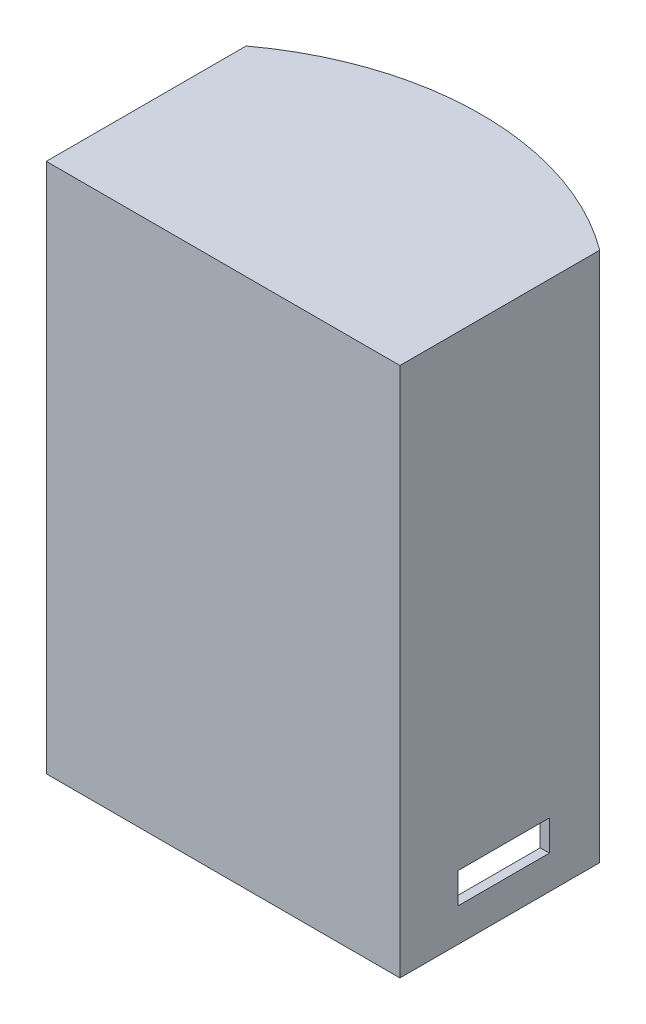
ISO-10303-21;
HEADER;
FILE_DESCRIPTION(('STEP AP214'),'2;1');
FILE_NAME('part.step','',(''),(''),'','','');
FILE_SCHEMA(('AUTOMOTIVE_DESIGN { 1 0 10303 214 1 1 1 1 }'));
ENDSEC;
DATA;
#1=APPLICATION_CONTEXT('core data for automotive mechanical design processes');
#2=APPLICATION_PROTOCOL_DEFINITION('international standard','automotive_design',2000,#1);
#3=PRODUCT_CONTEXT('',#1,'mechanical');
#4=PRODUCT('Part','Part','',(#3));
#5=PRODUCT_RELATED_PRODUCT_CATEGORY('part','',(#4));
#6=PRODUCT_DEFINITION_FORMATION('','',#4);
#7=PRODUCT_DEFINITION_CONTEXT('part definition',#1,'design');
#8=PRODUCT_DEFINITION('design','',#6,#7);
#9=PRODUCT_DEFINITION_SHAPE('','',#8);
#10=(LENGTH_UNIT() NAMED_UNIT(*) SI_UNIT(.MILLI.,.METRE.));
#11=(NAMED_UNIT(*) PLANE_ANGLE_UNIT() SI_UNIT($,.RADIAN.));
#12=(NAMED_UNIT(*) SI_UNIT($,.STERADIAN.) SOLID_ANGLE_UNIT());
#13=UNCERTAINTY_MEASURE_WITH_UNIT(LENGTH_MEASURE(1.E-05),#10,'distance_accuracy_value','');
#14=(GEOMETRIC_REPRESENTATION_CONTEXT(3) GLOBAL_UNCERTAINTY_ASSIGNED_CONTEXT((#13)) GLOBAL_UNIT_ASSIGNED_CONTEXT((#10,
#11,#12)) REPRESENTATION_CONTEXT('',''));
#15=CARTESIAN_POINT('',(0.,0.,0.));
#16=DIRECTION('',(0.,0.,1.));
#17=DIRECTION('',(1.,0.,0.));
#18=AXIS2_PLACEMENT_3D('',#15,#16,#17);
#19=CARTESIAN_POINT('',(16.,85.,15.));
#20=DIRECTION('',(1.,0.,0.));
#21=DIRECTION('',(0.,0.,-1.));
#22=AXIS2_PLACEMENT_3D('',#19,#20,#21);
#23=PLANE('',#22);
#24=DIRECTION('',(0.,1.,0.));
#25=VECTOR('',#24,1.);
#26=CARTESIAN_POINT('',(16.,85.,15.));
#27=LINE('',#26,#25);
#28=CARTESIAN_POINT('',(16.,11.,15.));
#29=VERTEX_POINT('',#28);
#30=CARTESIAN_POINT('',(16.,16.,15.));
#31=VERTEX_POINT('',#30);
#32=EDGE_CURVE('E264',#29,#31,#27,.T.);
#33=ORIENTED_EDGE('',*,*,#32,.T.);
#34=DIRECTION('',(0.,0.,1.));
#35=VECTOR('',#34,1.);
#36=CARTESIAN_POINT('',(16.,16.,12.));
#37=LINE('',#36,#35);
#38=CARTESIAN_POINT('',(16.,16.,12.));
#39=VERTEX_POINT('',#38);
#40=EDGE_CURVE('E300',#39,#31,#37,.T.);
#41=ORIENTED_EDGE('',*,*,#40,.F.);
#42=DIRECTION('',(0.,1.,0.));
#43=VECTOR('',#42,1.);
#44=CARTESIAN_POINT('',(16.,14.,12.));
#45=LINE('',#44,#43);
#46=CARTESIAN_POINT('',(16.,14.,12.));
#47=VERTEX_POINT('',#46);
#48=EDGE_CURVE('E292',#47,#39,#45,.T.);
#49=ORIENTED_EDGE('',*,*,#48,.F.);
#50=DIRECTION('',(0.,0.707106781186544,-0.707106781186551));
#51=VECTOR('',#50,1.);
#52=CARTESIAN_POINT('',(16.,47.9999999999997,-22.));
#53=LINE('',#52,#51);
#54=EDGE_CURVE('E11',#47,#29,#53,.F.);
#55=ORIENTED_EDGE('',*,*,#54,.T.);
#56=EDGE_LOOP('',(#33,#41,#49,#55));
#57=FACE_BOUND('',#56,.T.);
#58=ADVANCED_FACE('F35',(#57),#23,.F.);
#59=CARTESIAN_POINT('',(-16.,85.,15.));
#60=DIRECTION('',(-1.,0.,0.));
#61=DIRECTION('',(0.,0.,1.));
#62=AXIS2_PLACEMENT_3D('',#59,#60,#61);
#63=PLANE('',#62);
#64=DIRECTION('',(0.,-1.,0.));
#65=VECTOR('',#64,1.);
#66=CARTESIAN_POINT('',(-16.,85.,15.));
#67=LINE('',#66,#65);
#68=CARTESIAN_POINT('',(-16.,16.,15.));
#69=VERTEX_POINT('',#68);
#70=CARTESIAN_POINT('',(-16.,11.,15.));
#71=VERTEX_POINT('',#70);
#72=EDGE_CURVE('E262',#69,#71,#67,.T.);
#73=ORIENTED_EDGE('',*,*,#72,.T.);
#74=DIRECTION('',(0.,-0.707106781186544,0.707106781186551));
#75=VECTOR('',#74,1.);
#76=CARTESIAN_POINT('',(-16.,47.9999999999997,-22.));
#77=LINE('',#76,#75);
#78=CARTESIAN_POINT('',(-16.,14.,12.));
#79=VERTEX_POINT('',#78);
#80=EDGE_CURVE('E43',#71,#79,#77,.F.);
#81=ORIENTED_EDGE('',*,*,#80,.T.);
#82=DIRECTION('',(0.,-1.,0.));
#83=VECTOR('',#82,1.);
#84=CARTESIAN_POINT('',(-16.,14.,12.));
#85=LINE('',#84,#83);
#86=CARTESIAN_POINT('',(-16.,16.,12.));
#87=VERTEX_POINT('',#86);
#88=EDGE_CURVE('E272',#87,#79,#85,.T.);
#89=ORIENTED_EDGE('',*,*,#88,.F.);
#90=DIRECTION('',(0.,0.,1.));
#91=VECTOR('',#90,1.);
#92=CARTESIAN_POINT('',(-16.,16.,12.));
#93=LINE('',#92,#91);
#94=EDGE_CURVE('E278',#87,#69,#93,.T.);
#95=ORIENTED_EDGE('',*,*,#94,.T.);
#96=EDGE_LOOP('',(#73,#81,#89,#95));
#97=FACE_BOUND('',#96,.T.);
#98=ADVANCED_FACE('F384',(#97),#63,.F.);
#99=CARTESIAN_POINT('',(0.,85.,23.3475438007224));
#100=DIRECTION('',(0.,1.,0.));
#101=DIRECTION('',(0.,0.,1.));
#102=AXIS2_PLACEMENT_3D('',#99,#100,#101);
#103=PLANE('',#102);
#104=DIRECTION('',(-1.,0.,0.));
#105=VECTOR('',#104,1.);
#106=CARTESIAN_POINT('',(16.,85.,15.));
#107=LINE('',#106,#105);
#108=CARTESIAN_POINT('',(27.5,85.,15.));
#109=VERTEX_POINT('',#108);
#110=CARTESIAN_POINT('',(-27.5,85.,15.));
#111=VERTEX_POINT('',#110);
#112=EDGE_CURVE('E323',#109,#111,#107,.T.);
#113=ORIENTED_EDGE('',*,*,#112,.T.);
#114=DIRECTION('',(0.,0.,-1.));
#115=VECTOR('',#114,1.);
#116=CARTESIAN_POINT('',(-27.5,85.,15.));
#117=LINE('',#116,#115);
#118=CARTESIAN_POINT('',(-27.5,85.,-15.));
#119=VERTEX_POINT('',#118);
#120=EDGE_CURVE('E325',#111,#119,#117,.T.);
#121=ORIENTED_EDGE('',*,*,#120,.T.);
#122=CARTESIAN_POINT('',(0.,85.,23.3475438007224));
#123=DIRECTION('',(0.,-1.,0.));
#124=DIRECTION('',(0.,0.,-1.));
#125=AXIS2_PLACEMENT_3D('',#122,#123,#124);
#126=CIRCLE('',#125,47.1888134577288);
#127=CARTESIAN_POINT('',(27.5,85.,-15.));
#128=VERTEX_POINT('',#127);
#129=EDGE_CURVE('E316',#119,#128,#126,.T.);
#130=ORIENTED_EDGE('',*,*,#129,.T.);
#131=DIRECTION('',(0.,0.,1.));
#132=VECTOR('',#131,1.);
#133=CARTESIAN_POINT('',(27.5,85.,15.));
#134=LINE('',#133,#132);
#135=EDGE_CURVE('E319',#128,#109,#134,.T.);
#136=ORIENTED_EDGE('',*,*,#135,.T.);
#137=EDGE_LOOP('',(#113,#121,#130,#136));
#138=FACE_BOUND('',#137,.T.);
#139=ADVANCED_FACE('F413',(#138),#103,.F.);
#140=CARTESIAN_POINT('',(-27.5,85.,15.));
#141=DIRECTION('',(-1.,0.,0.));
#142=DIRECTION('',(0.,0.,1.));
#143=AXIS2_PLACEMENT_3D('',#140,#141,#142);
#144=PLANE('',#143);
#145=DIRECTION('',(0.,0.,-1.));
#146=VECTOR('',#145,1.);
#147=CARTESIAN_POINT('',(-27.5,10.4855256282735,15.));
#148=LINE('',#147,#146);
#149=CARTESIAN_POINT('',(-27.5,10.4855256282735,7.5));
#150=VERTEX_POINT('',#149);
#151=CARTESIAN_POINT('',(-27.5,10.4855256282735,-7.5));
#152=VERTEX_POINT('',#151);
#153=EDGE_CURVE('E244',#150,#152,#148,.T.);
#154=ORIENTED_EDGE('',*,*,#153,.T.);
#155=DIRECTION('',(0.,-1.,0.));
#156=VECTOR('',#155,1.);
#157=CARTESIAN_POINT('',(-27.5,85.,-7.49999999999995));
#158=LINE('',#157,#156);
#159=CARTESIAN_POINT('',(-27.5,5.48552562827353,-7.5));
#160=VERTEX_POINT('',#159);
#161=EDGE_CURVE('E201',#152,#160,#158,.T.);
#162=ORIENTED_EDGE('',*,*,#161,.T.);
#163=DIRECTION('',(0.,0.,1.));
#164=VECTOR('',#163,1.);
#165=CARTESIAN_POINT('',(-27.5,5.48552562827354,15.));
#166=LINE('',#165,#164);
#167=CARTESIAN_POINT('',(-27.5,5.48552562827353,7.5));
#168=VERTEX_POINT('',#167);
#169=EDGE_CURVE('E255',#160,#168,#166,.T.);
#170=ORIENTED_EDGE('',*,*,#169,.T.);
#171=DIRECTION('',(0.,1.,0.));
#172=VECTOR('',#171,1.);
#173=CARTESIAN_POINT('',(-27.5,85.,7.50000000000001));
#174=LINE('',#173,#172);
#175=EDGE_CURVE('E249',#168,#150,#174,.T.);
#176=ORIENTED_EDGE('',*,*,#175,.T.);
#177=EDGE_LOOP('',(#154,#162,#170,#176));
#178=FACE_BOUND('',#177,.T.);
#179=DIRECTION('',(0.,1.,0.));
#180=VECTOR('',#179,1.);
#181=CARTESIAN_POINT('',(-27.5,14.,12.));
#182=LINE('',#181,#180);
#183=CARTESIAN_POINT('',(-27.5,14.,12.));
#184=VERTEX_POINT('',#183);
#185=CARTESIAN_POINT('',(-27.5,16.,12.));
#186=VERTEX_POINT('',#185);
#187=EDGE_CURVE('E267',#184,#186,#182,.T.);
#188=ORIENTED_EDGE('',*,*,#187,.F.);
#189=DIRECTION('',(0.,0.707106781186544,-0.707106781186551));
#190=VECTOR('',#189,1.);
#191=CARTESIAN_POINT('',(-27.5,14.,12.));
#192=LINE('',#191,#190);
#193=CARTESIAN_POINT('',(-27.5,11.,15.));
#194=VERTEX_POINT('',#193);
#195=EDGE_CURVE('E373',#184,#194,#192,.F.);
#196=ORIENTED_EDGE('',*,*,#195,.T.);
#197=DIRECTION('',(0.,-1.,0.));
#198=VECTOR('',#197,1.);
#199=CARTESIAN_POINT('',(-27.5,85.,15.));
#200=LINE('',#199,#198);
#201=CARTESIAN_POINT('',(-27.5,0.,15.));
#202=VERTEX_POINT('',#201);
#203=EDGE_CURVE('E350',#194,#202,#200,.T.);
#204=ORIENTED_EDGE('',*,*,#203,.T.);
#205=DIRECTION('',(0.,0.,-1.));
#206=VECTOR('',#205,1.);
#207=CARTESIAN_POINT('',(-27.5,0.,15.));
#208=LINE('',#207,#206);
#209=CARTESIAN_POINT('',(-27.5,0.,-15.));
#210=VERTEX_POINT('',#209);
#211=EDGE_CURVE('E320',#202,#210,#208,.T.);
#212=ORIENTED_EDGE('',*,*,#211,.T.);
#213=DIRECTION('',(0.,-1.,0.));
#214=VECTOR('',#213,1.);
#215=CARTESIAN_POINT('',(-27.5,85.,-15.));
#216=LINE('',#215,#214);
#217=EDGE_CURVE('E328',#119,#210,#216,.T.);
#218=ORIENTED_EDGE('',*,*,#217,.F.);
#219=ORIENTED_EDGE('',*,*,#120,.F.);
#220=CARTESIAN_POINT('',(-27.5,16.,15.));
#221=VERTEX_POINT('',#220);
#222=EDGE_CURVE('E351',#111,#221,#200,.T.);
#223=ORIENTED_EDGE('',*,*,#222,.T.);
#224=DIRECTION('',(0.,0.,1.));
#225=VECTOR('',#224,1.);
#226=CARTESIAN_POINT('',(-27.5,16.,12.));
#227=LINE('',#226,#225);
#228=EDGE_CURVE('E283',#186,#221,#227,.T.);
#229=ORIENTED_EDGE('',*,*,#228,.F.);
#230=EDGE_LOOP('',(#188,#196,#204,#212,#218,#219,#223,#229));
#231=FACE_BOUND('',#230,.T.);
#232=ADVANCED_FACE('F395',(#178,#231),#144,.F.);
#233=CARTESIAN_POINT('',(27.5,85.,15.));
#234=DIRECTION('',(1.,0.,0.));
#235=DIRECTION('',(0.,0.,-1.));
#236=AXIS2_PLACEMENT_3D('',#233,#234,#235);
#237=PLANE('',#236);
#238=DIRECTION('',(0.,0.,-1.));
#239=VECTOR('',#238,1.);
#240=CARTESIAN_POINT('',(27.5,5.48552562827354,15.));
#241=LINE('',#240,#239);
#242=CARTESIAN_POINT('',(27.5,5.48552562827353,7.5));
#243=VERTEX_POINT('',#242);
#244=CARTESIAN_POINT('',(27.5,5.48552562827353,-7.5));
#245=VERTEX_POINT('',#244);
#246=EDGE_CURVE('E252',#243,#245,#241,.T.);
#247=ORIENTED_EDGE('',*,*,#246,.T.);
#248=DIRECTION('',(0.,1.,0.));
#249=VECTOR('',#248,1.);
#250=CARTESIAN_POINT('',(27.5,85.,-7.49999999999995));
#251=LINE('',#250,#249);
#252=CARTESIAN_POINT('',(27.5,10.4855256282735,-7.5));
#253=VERTEX_POINT('',#252);
#254=EDGE_CURVE('E258',#245,#253,#251,.T.);
#255=ORIENTED_EDGE('',*,*,#254,.T.);
#256=DIRECTION('',(0.,0.,1.));
#257=VECTOR('',#256,1.);
#258=CARTESIAN_POINT('',(27.5,10.4855256282735,15.));
#259=LINE('',#258,#257);
#260=CARTESIAN_POINT('',(27.5,10.4855256282735,7.5));
#261=VERTEX_POINT('',#260);
#262=EDGE_CURVE('E235',#253,#261,#259,.T.);
#263=ORIENTED_EDGE('',*,*,#262,.T.);
#264=DIRECTION('',(0.,-1.,0.));
#265=VECTOR('',#264,1.);
#266=CARTESIAN_POINT('',(27.5,85.,7.50000000000001));
#267=LINE('',#266,#265);
#268=EDGE_CURVE('E246',#261,#243,#267,.T.);
#269=ORIENTED_EDGE('',*,*,#268,.T.);
#270=EDGE_LOOP('',(#247,#255,#263,#269));
#271=FACE_BOUND('',#270,.T.);
#272=DIRECTION('',(0.,-1.,0.));
#273=VECTOR('',#272,1.);
#274=CARTESIAN_POINT('',(27.5,85.,15.));
#275=LINE('',#274,#273);
#276=CARTESIAN_POINT('',(27.5,11.,15.));
#277=VERTEX_POINT('',#276);
#278=CARTESIAN_POINT('',(27.5,0.,15.));
#279=VERTEX_POINT('',#278);
#280=EDGE_CURVE('E366',#277,#279,#275,.T.);
#281=ORIENTED_EDGE('',*,*,#280,.F.);
#282=DIRECTION('',(0.,-0.707106781186544,0.707106781186551));
#283=VECTOR('',#282,1.);
#284=CARTESIAN_POINT('',(27.5,14.,12.));
#285=LINE('',#284,#283);
#286=CARTESIAN_POINT('',(27.5,14.,12.));
#287=VERTEX_POINT('',#286);
#288=EDGE_CURVE('E380',#277,#287,#285,.F.);
#289=ORIENTED_EDGE('',*,*,#288,.T.);
#290=DIRECTION('',(0.,-1.,0.));
#291=VECTOR('',#290,1.);
#292=CARTESIAN_POINT('',(27.5,14.,12.));
#293=LINE('',#292,#291);
#294=CARTESIAN_POINT('',(27.5,16.,12.));
#295=VERTEX_POINT('',#294);
#296=EDGE_CURVE('E286',#295,#287,#293,.T.);
#297=ORIENTED_EDGE('',*,*,#296,.F.);
#298=DIRECTION('',(0.,0.,1.));
#299=VECTOR('',#298,1.);
#300=CARTESIAN_POINT('',(27.5,16.,12.));
#301=LINE('',#300,#299);
#302=CARTESIAN_POINT('',(27.5,16.,15.));
#303=VERTEX_POINT('',#302);
#304=EDGE_CURVE('E296',#295,#303,#301,.T.);
#305=ORIENTED_EDGE('',*,*,#304,.T.);
#306=EDGE_CURVE('E367',#109,#303,#275,.T.);
#307=ORIENTED_EDGE('',*,*,#306,.F.);
#308=ORIENTED_EDGE('',*,*,#135,.F.);
#309=DIRECTION('',(0.,-1.,0.));
#310=VECTOR('',#309,1.);
#311=CARTESIAN_POINT('',(27.5,85.,-15.));
#312=LINE('',#311,#310);
#313=CARTESIAN_POINT('',(27.5,0.,-15.));
#314=VERTEX_POINT('',#313);
#315=EDGE_CURVE('E370',#128,#314,#312,.T.);
#316=ORIENTED_EDGE('',*,*,#315,.T.);
#317=DIRECTION('',(0.,0.,1.));
#318=VECTOR('',#317,1.);
#319=CARTESIAN_POINT('',(27.5,0.,15.));
#320=LINE('',#319,#318);
#321=EDGE_CURVE('E331',#314,#279,#320,.T.);
#322=ORIENTED_EDGE('',*,*,#321,.T.);
#323=EDGE_LOOP('',(#281,#289,#297,#305,#307,#308,#316,#322));
#324=FACE_BOUND('',#323,.T.);
#325=ADVANCED_FACE('F443',(#271,#324),#237,.F.);
#326=CARTESIAN_POINT('',(16.,85.,15.));
#327=DIRECTION('',(0.,0.,1.));
#328=DIRECTION('',(1.,0.,0.));
#329=AXIS2_PLACEMENT_3D('',#326,#327,#328);
#330=PLANE('',#329);
#331=DIRECTION('',(1.,0.,0.));
#332=VECTOR('',#331,1.);
#333=CARTESIAN_POINT('',(27.5,16.,15.));
#334=LINE('',#333,#332);
#335=EDGE_CURVE('E285',#31,#303,#334,.T.);
#336=ORIENTED_EDGE('',*,*,#335,.F.);
#337=ORIENTED_EDGE('',*,*,#32,.F.);
#338=DIRECTION('',(1.,0.,0.));
#339=VECTOR('',#338,1.);
#340=CARTESIAN_POINT('',(27.5,11.,15.));
#341=LINE('',#340,#339);
#342=EDGE_CURVE('E378',#29,#277,#341,.T.);
#343=ORIENTED_EDGE('',*,*,#342,.T.);
#344=ORIENTED_EDGE('',*,*,#280,.T.);
#345=DIRECTION('',(-1.,0.,0.));
#346=VECTOR('',#345,1.);
#347=CARTESIAN_POINT('',(-27.5,0.,15.));
#348=LINE('',#347,#346);
#349=EDGE_CURVE('E344',#279,#202,#348,.T.);
#350=ORIENTED_EDGE('',*,*,#349,.T.);
#351=ORIENTED_EDGE('',*,*,#203,.F.);
#352=DIRECTION('',(1.,0.,0.));
#353=VECTOR('',#352,1.);
#354=CARTESIAN_POINT('',(-16.,11.,15.));
#355=LINE('',#354,#353);
#356=EDGE_CURVE('E375',#194,#71,#355,.T.);
#357=ORIENTED_EDGE('',*,*,#356,.T.);
#358=ORIENTED_EDGE('',*,*,#72,.F.);
#359=DIRECTION('',(1.,0.,0.));
#360=VECTOR('',#359,1.);
#361=CARTESIAN_POINT('',(-27.5,16.,15.));
#362=LINE('',#361,#360);
#363=EDGE_CURVE('E266',#221,#69,#362,.T.);
#364=ORIENTED_EDGE('',*,*,#363,.F.);
#365=ORIENTED_EDGE('',*,*,#222,.F.);
#366=ORIENTED_EDGE('',*,*,#112,.F.);
#367=ORIENTED_EDGE('',*,*,#306,.T.);
#368=EDGE_LOOP('',(#336,#337,#343,#344,#350,#351,#357,#358,#364,#365,#366,#367));
#369=FACE_BOUND('',#368,.T.);
#370=ADVANCED_FACE('F399',(#369),#330,.F.);
#371=CARTESIAN_POINT('',(0.,85.,23.3475438007224));
#372=DIRECTION('',(0.,-1.,0.));
#373=DIRECTION('',(0.,0.,-1.));
#374=AXIS2_PLACEMENT_3D('',#371,#372,#373);
#375=CYLINDRICAL_SURFACE('',#374,47.1888134577288);
#376=CARTESIAN_POINT('',(0.,0.,23.3475438007224));
#377=DIRECTION('',(0.,-1.,0.));
#378=DIRECTION('',(0.,0.,-1.));
#379=AXIS2_PLACEMENT_3D('',#376,#377,#378);
#380=CIRCLE('',#379,47.1888134577288);
#381=EDGE_CURVE('E315',#210,#314,#380,.T.);
#382=ORIENTED_EDGE('',*,*,#381,.T.);
#383=ORIENTED_EDGE('',*,*,#315,.F.);
#384=ORIENTED_EDGE('',*,*,#129,.F.);
#385=ORIENTED_EDGE('',*,*,#217,.T.);
#386=EDGE_LOOP('',(#382,#383,#384,#385));
#387=FACE_BOUND('',#386,.T.);
#388=ADVANCED_FACE('F410',(#387),#375,.F.);
#389=CARTESIAN_POINT('',(29.,85.,15.));
#390=DIRECTION('',(-1.,0.,0.));
#391=DIRECTION('',(0.,0.,1.));
#392=AXIS2_PLACEMENT_3D('',#389,#390,#391);
#393=PLANE('',#392);
#394=DIRECTION('',(0.,0.,1.));
#395=VECTOR('',#394,1.);
#396=CARTESIAN_POINT('',(29.,10.4855256282735,7.5));
#397=LINE('',#396,#395);
#398=CARTESIAN_POINT('',(29.,10.4855256282735,-7.5));
#399=VERTEX_POINT('',#398);
#400=CARTESIAN_POINT('',(29.,10.4855256282735,7.5));
#401=VERTEX_POINT('',#400);
#402=EDGE_CURVE('E229',#399,#401,#397,.T.);
#403=ORIENTED_EDGE('',*,*,#402,.F.);
#404=DIRECTION('',(0.,1.,0.));
#405=VECTOR('',#404,1.);
#406=CARTESIAN_POINT('',(29.,10.4855256282735,-7.5));
#407=LINE('',#406,#405);
#408=CARTESIAN_POINT('',(29.,5.48552562827353,-7.5));
#409=VERTEX_POINT('',#408);
#410=EDGE_CURVE('E227',#409,#399,#407,.T.);
#411=ORIENTED_EDGE('',*,*,#410,.F.);
#412=DIRECTION('',(0.,0.,-1.));
#413=VECTOR('',#412,1.);
#414=CARTESIAN_POINT('',(29.,5.48552562827353,7.5));
#415=LINE('',#414,#413);
#416=CARTESIAN_POINT('',(29.,5.48552562827353,7.5));
#417=VERTEX_POINT('',#416);
#418=EDGE_CURVE('E219',#417,#409,#415,.T.);
#419=ORIENTED_EDGE('',*,*,#418,.F.);
#420=DIRECTION('',(0.,-1.,0.));
#421=VECTOR('',#420,1.);
#422=CARTESIAN_POINT('',(29.,10.4855256282735,7.5));
#423=LINE('',#422,#421);
#424=EDGE_CURVE('E222',#401,#417,#423,.T.);
#425=ORIENTED_EDGE('',*,*,#424,.F.);
#426=EDGE_LOOP('',(#403,#411,#419,#425));
#427=FACE_BOUND('',#426,.T.);
#428=DIRECTION('',(0.,0.,-1.));
#429=VECTOR('',#428,1.);
#430=CARTESIAN_POINT('',(29.,0.,15.));
#431=LINE('',#430,#429);
#432=CARTESIAN_POINT('',(29.,0.,17.));
#433=VERTEX_POINT('',#432);
#434=CARTESIAN_POINT('',(29.,0.,-15.7625643034686));
#435=VERTEX_POINT('',#434);
#436=EDGE_CURVE('E334',#433,#435,#431,.T.);
#437=ORIENTED_EDGE('',*,*,#436,.T.);
#438=DIRECTION('',(0.,-1.,0.));
#439=VECTOR('',#438,1.);
#440=CARTESIAN_POINT('',(29.,85.,-15.7625643034686));
#441=LINE('',#440,#439);
#442=CARTESIAN_POINT('',(29.,87.,-15.7625643034686));
#443=VERTEX_POINT('',#442);
#444=EDGE_CURVE('E360',#443,#435,#441,.T.);
#445=ORIENTED_EDGE('',*,*,#444,.F.);
#446=DIRECTION('',(0.,0.,-1.));
#447=VECTOR('',#446,1.);
#448=CARTESIAN_POINT('',(29.,87.,17.));
#449=LINE('',#448,#447);
#450=CARTESIAN_POINT('',(29.,87.,17.));
#451=VERTEX_POINT('',#450);
#452=EDGE_CURVE('E306',#451,#443,#449,.T.);
#453=ORIENTED_EDGE('',*,*,#452,.F.);
#454=DIRECTION('',(0.,-1.,0.));
#455=VECTOR('',#454,1.);
#456=CARTESIAN_POINT('',(29.,85.,17.));
#457=LINE('',#456,#455);
#458=EDGE_CURVE('E363',#451,#433,#457,.T.);
#459=ORIENTED_EDGE('',*,*,#458,.T.);
#460=EDGE_LOOP('',(#437,#445,#453,#459));
#461=FACE_BOUND('',#460,.T.);
#462=ADVANCED_FACE('F439',(#427,#461),#393,.F.);
#463=CARTESIAN_POINT('',(0.,85.,23.3475438007224));
#464=DIRECTION('',(0.,-1.,0.));
#465=DIRECTION('',(0.,0.,-1.));
#466=AXIS2_PLACEMENT_3D('',#463,#464,#465);
#467=CYLINDRICAL_SURFACE('',#466,48.6888134577288);
#468=CARTESIAN_POINT('',(0.,0.,23.3475438007224));
#469=DIRECTION('',(0.,1.,0.));
#470=DIRECTION('',(0.,0.,-1.));
#471=AXIS2_PLACEMENT_3D('',#468,#469,#470);
#472=CIRCLE('',#471,48.6888134577288);
#473=CARTESIAN_POINT('',(-29.,0.,-15.7625643034686));
#474=VERTEX_POINT('',#473);
#475=EDGE_CURVE('E336',#435,#474,#472,.T.);
#476=ORIENTED_EDGE('',*,*,#475,.T.);
#477=DIRECTION('',(0.,-1.,0.));
#478=VECTOR('',#477,1.);
#479=CARTESIAN_POINT('',(-29.,85.,-15.7625643034686));
#480=LINE('',#479,#478);
#481=CARTESIAN_POINT('',(-29.,87.,-15.7625643034686));
#482=VERTEX_POINT('',#481);
#483=EDGE_CURVE('E357',#482,#474,#480,.T.);
#484=ORIENTED_EDGE('',*,*,#483,.F.);
#485=CARTESIAN_POINT('',(0.,87.,23.3475438007224));
#486=DIRECTION('',(0.,1.,0.));
#487=DIRECTION('',(0.,0.,1.));
#488=AXIS2_PLACEMENT_3D('',#485,#486,#487);
#489=CIRCLE('',#488,48.6888134577288);
#490=EDGE_CURVE('E309',#443,#482,#489,.T.);
#491=ORIENTED_EDGE('',*,*,#490,.F.);
#492=ORIENTED_EDGE('',*,*,#444,.T.);
#493=EDGE_LOOP('',(#476,#484,#491,#492));
#494=FACE_BOUND('',#493,.T.);
#495=ADVANCED_FACE('F490',(#494),#467,.T.);
#496=CARTESIAN_POINT('',(-29.,85.,15.));
#497=DIRECTION('',(1.,0.,0.));
#498=DIRECTION('',(0.,0.,-1.));
#499=AXIS2_PLACEMENT_3D('',#496,#497,#498);
#500=PLANE('',#499);
#501=DIRECTION('',(0.,0.,-1.));
#502=VECTOR('',#501,1.);
#503=CARTESIAN_POINT('',(-29.,5.48552562827353,7.5));
#504=LINE('',#503,#502);
#505=CARTESIAN_POINT('',(-29.,5.48552562827353,7.5));
#506=VERTEX_POINT('',#505);
#507=CARTESIAN_POINT('',(-29.,5.48552562827353,-7.5));
#508=VERTEX_POINT('',#507);
#509=EDGE_CURVE('E218',#506,#508,#504,.T.);
#510=ORIENTED_EDGE('',*,*,#509,.T.);
#511=DIRECTION('',(0.,1.,0.));
#512=VECTOR('',#511,1.);
#513=CARTESIAN_POINT('',(-29.,10.4855256282735,-7.5));
#514=LINE('',#513,#512);
#515=CARTESIAN_POINT('',(-29.,10.4855256282735,-7.5));
#516=VERTEX_POINT('',#515);
#517=EDGE_CURVE('E198',#508,#516,#514,.T.);
#518=ORIENTED_EDGE('',*,*,#517,.T.);
#519=DIRECTION('',(0.,0.,1.));
#520=VECTOR('',#519,1.);
#521=CARTESIAN_POINT('',(-29.,10.4855256282735,7.5));
#522=LINE('',#521,#520);
#523=CARTESIAN_POINT('',(-29.,10.4855256282735,7.5));
#524=VERTEX_POINT('',#523);
#525=EDGE_CURVE('E207',#516,#524,#522,.T.);
#526=ORIENTED_EDGE('',*,*,#525,.T.);
#527=DIRECTION('',(0.,-1.,0.));
#528=VECTOR('',#527,1.);
#529=CARTESIAN_POINT('',(-29.,10.4855256282735,7.5));
#530=LINE('',#529,#528);
#531=EDGE_CURVE('E213',#524,#506,#530,.T.);
#532=ORIENTED_EDGE('',*,*,#531,.T.);
#533=EDGE_LOOP('',(#510,#518,#526,#532));
#534=FACE_BOUND('',#533,.T.);
#535=DIRECTION('',(0.,0.,1.));
#536=VECTOR('',#535,1.);
#537=CARTESIAN_POINT('',(-29.,0.,15.));
#538=LINE('',#537,#536);
#539=CARTESIAN_POINT('',(-29.,0.,17.));
#540=VERTEX_POINT('',#539);
#541=EDGE_CURVE('E339',#474,#540,#538,.T.);
#542=ORIENTED_EDGE('',*,*,#541,.T.);
#543=DIRECTION('',(0.,-1.,0.));
#544=VECTOR('',#543,1.);
#545=CARTESIAN_POINT('',(-29.,85.,17.));
#546=LINE('',#545,#544);
#547=CARTESIAN_POINT('',(-29.,87.,17.));
#548=VERTEX_POINT('',#547);
#549=EDGE_CURVE('E354',#548,#540,#546,.T.);
#550=ORIENTED_EDGE('',*,*,#549,.F.);
#551=DIRECTION('',(0.,0.,1.));
#552=VECTOR('',#551,1.);
#553=CARTESIAN_POINT('',(-29.,87.,-15.7625643034686));
#554=LINE('',#553,#552);
#555=EDGE_CURVE('E312',#482,#548,#554,.T.);
#556=ORIENTED_EDGE('',*,*,#555,.F.);
#557=ORIENTED_EDGE('',*,*,#483,.T.);
#558=EDGE_LOOP('',(#542,#550,#556,#557));
#559=FACE_BOUND('',#558,.T.);
#560=ADVANCED_FACE('F215',(#534,#559),#500,.F.);
#561=CARTESIAN_POINT('',(-27.5,85.,17.));
#562=DIRECTION('',(0.,0.,-1.));
#563=DIRECTION('',(-1.,0.,0.));
#564=AXIS2_PLACEMENT_3D('',#561,#562,#563);
#565=PLANE('',#564);
#566=DIRECTION('',(1.,0.,0.));
#567=VECTOR('',#566,1.);
#568=CARTESIAN_POINT('',(-27.5,0.,17.));
#569=LINE('',#568,#567);
#570=EDGE_CURVE('E342',#540,#433,#569,.T.);
#571=ORIENTED_EDGE('',*,*,#570,.T.);
#572=ORIENTED_EDGE('',*,*,#458,.F.);
#573=DIRECTION('',(1.,0.,0.));
#574=VECTOR('',#573,1.);
#575=CARTESIAN_POINT('',(16.,87.,17.));
#576=LINE('',#575,#574);
#577=EDGE_CURVE('E303',#548,#451,#576,.T.);
#578=ORIENTED_EDGE('',*,*,#577,.F.);
#579=ORIENTED_EDGE('',*,*,#549,.T.);
#580=EDGE_LOOP('',(#571,#572,#578,#579));
#581=FACE_BOUND('',#580,.T.);
#582=ADVANCED_FACE('F482',(#581),#565,.F.);
#583=CARTESIAN_POINT('',(0.,0.,23.3475438007224));
#584=DIRECTION('',(0.,-1.,0.));
#585=DIRECTION('',(0.,0.,-1.));
#586=AXIS2_PLACEMENT_3D('',#583,#584,#585);
#587=PLANE('',#586);
#588=ORIENTED_EDGE('',*,*,#349,.F.);
#589=ORIENTED_EDGE('',*,*,#321,.F.);
#590=ORIENTED_EDGE('',*,*,#381,.F.);
#591=ORIENTED_EDGE('',*,*,#211,.F.);
#592=EDGE_LOOP('',(#588,#589,#590,#591));
#593=FACE_BOUND('',#592,.T.);
#594=ORIENTED_EDGE('',*,*,#436,.F.);
#595=ORIENTED_EDGE('',*,*,#570,.F.);
#596=ORIENTED_EDGE('',*,*,#541,.F.);
#597=ORIENTED_EDGE('',*,*,#475,.F.);
#598=EDGE_LOOP('',(#594,#595,#596,#597));
#599=FACE_BOUND('',#598,.T.);
#600=ADVANCED_FACE('F405',(#593,#599),#587,.T.);
#601=CARTESIAN_POINT('',(0.,87.,23.3475438007224));
#602=DIRECTION('',(0.,1.,0.));
#603=DIRECTION('',(0.,0.,1.));
#604=AXIS2_PLACEMENT_3D('',#601,#602,#603);
#605=PLANE('',#604);
#606=ORIENTED_EDGE('',*,*,#577,.T.);
#607=ORIENTED_EDGE('',*,*,#452,.T.);
#608=ORIENTED_EDGE('',*,*,#490,.T.);
#609=ORIENTED_EDGE('',*,*,#555,.T.);
#610=EDGE_LOOP('',(#606,#607,#608,#609));
#611=FACE_BOUND('',#610,.T.);
#612=ADVANCED_FACE('F470',(#611),#605,.T.);
#613=CARTESIAN_POINT('',(27.5,16.,12.));
#614=DIRECTION('',(0.,-1.,0.));
#615=DIRECTION('',(0.,0.,-1.));
#616=AXIS2_PLACEMENT_3D('',#613,#614,#615);
#617=PLANE('',#616);
#618=ORIENTED_EDGE('',*,*,#335,.T.);
#619=ORIENTED_EDGE('',*,*,#304,.F.);
#620=DIRECTION('',(1.,0.,0.));
#621=VECTOR('',#620,1.);
#622=CARTESIAN_POINT('',(27.5,16.,12.));
#623=LINE('',#622,#621);
#624=EDGE_CURVE('E294',#39,#295,#623,.T.);
#625=ORIENTED_EDGE('',*,*,#624,.F.);
#626=ORIENTED_EDGE('',*,*,#40,.T.);
#627=EDGE_LOOP('',(#618,#619,#625,#626));
#628=FACE_BOUND('',#627,.T.);
#629=ADVANCED_FACE('F427',(#628),#617,.F.);
#630=CARTESIAN_POINT('',(0.,0.,12.));
#631=DIRECTION('',(0.,0.,1.));
#632=DIRECTION('',(1.,0.,0.));
#633=AXIS2_PLACEMENT_3D('',#630,#631,#632);
#634=PLANE('',#633);
#635=ORIENTED_EDGE('',*,*,#296,.T.);
#636=DIRECTION('',(-1.,0.,0.));
#637=VECTOR('',#636,1.);
#638=CARTESIAN_POINT('',(27.5,14.,12.));
#639=LINE('',#638,#637);
#640=EDGE_CURVE('E289',#287,#47,#639,.T.);
#641=ORIENTED_EDGE('',*,*,#640,.T.);
#642=ORIENTED_EDGE('',*,*,#48,.T.);
#643=ORIENTED_EDGE('',*,*,#624,.T.);
#644=EDGE_LOOP('',(#635,#641,#642,#643));
#645=FACE_BOUND('',#644,.T.);
#646=ADVANCED_FACE('F420',(#645),#634,.F.);
#647=CARTESIAN_POINT('',(-27.5,16.,12.));
#648=DIRECTION('',(0.,-1.,0.));
#649=DIRECTION('',(0.,0.,-1.));
#650=AXIS2_PLACEMENT_3D('',#647,#648,#649);
#651=PLANE('',#650);
#652=ORIENTED_EDGE('',*,*,#363,.T.);
#653=ORIENTED_EDGE('',*,*,#94,.F.);
#654=DIRECTION('',(1.,0.,0.));
#655=VECTOR('',#654,1.);
#656=CARTESIAN_POINT('',(-27.5,16.,12.));
#657=LINE('',#656,#655);
#658=EDGE_CURVE('E270',#186,#87,#657,.T.);
#659=ORIENTED_EDGE('',*,*,#658,.F.);
#660=ORIENTED_EDGE('',*,*,#228,.T.);
#661=EDGE_LOOP('',(#652,#653,#659,#660));
#662=FACE_BOUND('',#661,.T.);
#663=ADVANCED_FACE('F418',(#662),#651,.F.);
#664=CARTESIAN_POINT('',(0.,0.,12.));
#665=DIRECTION('',(0.,0.,-1.));
#666=DIRECTION('',(-1.,0.,0.));
#667=AXIS2_PLACEMENT_3D('',#664,#665,#666);
#668=PLANE('',#667);
#669=ORIENTED_EDGE('',*,*,#187,.T.);
#670=ORIENTED_EDGE('',*,*,#658,.T.);
#671=ORIENTED_EDGE('',*,*,#88,.T.);
#672=DIRECTION('',(-1.,0.,0.));
#673=VECTOR('',#672,1.);
#674=CARTESIAN_POINT('',(-27.5,14.,12.));
#675=LINE('',#674,#673);
#676=EDGE_CURVE('E275',#79,#184,#675,.T.);
#677=ORIENTED_EDGE('',*,*,#676,.T.);
#678=EDGE_LOOP('',(#669,#670,#671,#677));
#679=FACE_BOUND('',#678,.T.);
#680=ADVANCED_FACE('F389',(#679),#668,.T.);
#681=CARTESIAN_POINT('',(-27.5,14.,12.));
#682=DIRECTION('',(0.,-0.707106781186551,-0.707106781186544));
#683=DIRECTION('',(1.,0.,0.));
#684=AXIS2_PLACEMENT_3D('',#681,#682,#683);
#685=PLANE('',#684);
#686=ORIENTED_EDGE('',*,*,#80,.F.);
#687=ORIENTED_EDGE('',*,*,#356,.F.);
#688=ORIENTED_EDGE('',*,*,#195,.F.);
#689=ORIENTED_EDGE('',*,*,#676,.F.);
#690=EDGE_LOOP('',(#686,#687,#688,#689));
#691=FACE_BOUND('',#690,.T.);
#692=ADVANCED_FACE('F392',(#691),#685,.T.);
#693=CARTESIAN_POINT('',(27.5,14.,12.));
#694=DIRECTION('',(0.,-0.707106781186551,-0.707106781186544));
#695=DIRECTION('',(1.,0.,0.));
#696=AXIS2_PLACEMENT_3D('',#693,#694,#695);
#697=PLANE('',#696);
#698=ORIENTED_EDGE('',*,*,#288,.F.);
#699=ORIENTED_EDGE('',*,*,#342,.F.);
#700=ORIENTED_EDGE('',*,*,#54,.F.);
#701=ORIENTED_EDGE('',*,*,#640,.F.);
#702=EDGE_LOOP('',(#698,#699,#700,#701));
#703=FACE_BOUND('',#702,.T.);
#704=ADVANCED_FACE('F37',(#703),#697,.T.);
#705=CARTESIAN_POINT('',(-29.,10.4855256282735,7.5));
#706=DIRECTION('',(0.,1.,0.));
#707=DIRECTION('',(0.,0.,1.));
#708=AXIS2_PLACEMENT_3D('',#705,#706,#707);
#709=PLANE('',#708);
#710=DIRECTION('',(1.,0.,0.));
#711=VECTOR('',#710,1.);
#712=CARTESIAN_POINT('',(-29.,10.4855256282735,7.5));
#713=LINE('',#712,#711);
#714=EDGE_CURVE('E210',#524,#150,#713,.T.);
#715=ORIENTED_EDGE('',*,*,#714,.F.);
#716=ORIENTED_EDGE('',*,*,#525,.F.);
#717=DIRECTION('',(1.,0.,0.));
#718=VECTOR('',#717,1.);
#719=CARTESIAN_POINT('',(-29.,10.4855256282735,-7.5));
#720=LINE('',#719,#718);
#721=EDGE_CURVE('E50',#516,#152,#720,.T.);
#722=ORIENTED_EDGE('',*,*,#721,.T.);
#723=ORIENTED_EDGE('',*,*,#153,.F.);
#724=EDGE_LOOP('',(#715,#716,#722,#723));
#725=FACE_BOUND('',#724,.T.);
#726=ADVANCED_FACE('F208',(#725),#709,.F.);
#727=CARTESIAN_POINT('',(-29.,10.4855256282735,7.5));
#728=DIRECTION('',(0.,0.,1.));
#729=DIRECTION('',(0.,-1.,0.));
#730=AXIS2_PLACEMENT_3D('',#727,#728,#729);
#731=PLANE('',#730);
#732=DIRECTION('',(1.,0.,0.));
#733=VECTOR('',#732,1.);
#734=CARTESIAN_POINT('',(-29.,5.48552562827353,7.5));
#735=LINE('',#734,#733);
#736=EDGE_CURVE('E237',#506,#168,#735,.T.);
#737=ORIENTED_EDGE('',*,*,#736,.F.);
#738=ORIENTED_EDGE('',*,*,#531,.F.);
#739=ORIENTED_EDGE('',*,*,#714,.T.);
#740=ORIENTED_EDGE('',*,*,#175,.F.);
#741=EDGE_LOOP('',(#737,#738,#739,#740));
#742=FACE_BOUND('',#741,.T.);
#743=ADVANCED_FACE('F456',(#742),#731,.F.);
#744=CARTESIAN_POINT('',(-29.,5.48552562827353,7.5));
#745=DIRECTION('',(0.,-1.,0.));
#746=DIRECTION('',(0.,0.,-1.));
#747=AXIS2_PLACEMENT_3D('',#744,#745,#746);
#748=PLANE('',#747);
#749=DIRECTION('',(1.,0.,0.));
#750=VECTOR('',#749,1.);
#751=CARTESIAN_POINT('',(-29.,5.48552562827353,-7.5));
#752=LINE('',#751,#750);
#753=EDGE_CURVE('E233',#508,#160,#752,.T.);
#754=ORIENTED_EDGE('',*,*,#753,.F.);
#755=ORIENTED_EDGE('',*,*,#509,.F.);
#756=ORIENTED_EDGE('',*,*,#736,.T.);
#757=ORIENTED_EDGE('',*,*,#169,.F.);
#758=EDGE_LOOP('',(#754,#755,#756,#757));
#759=FACE_BOUND('',#758,.T.);
#760=ADVANCED_FACE('F527',(#759),#748,.F.);
#761=CARTESIAN_POINT('',(-29.,10.4855256282735,-7.5));
#762=DIRECTION('',(0.,0.,-1.));
#763=DIRECTION('',(0.,1.,0.));
#764=AXIS2_PLACEMENT_3D('',#761,#762,#763);
#765=PLANE('',#764);
#766=ORIENTED_EDGE('',*,*,#721,.F.);
#767=ORIENTED_EDGE('',*,*,#517,.F.);
#768=ORIENTED_EDGE('',*,*,#753,.T.);
#769=ORIENTED_EDGE('',*,*,#161,.F.);
#770=EDGE_LOOP('',(#766,#767,#768,#769));
#771=FACE_BOUND('',#770,.T.);
#772=ADVANCED_FACE('F195',(#771),#765,.F.);
#773=EDGE_CURVE('E236',#245,#409,#752,.T.);
#774=ORIENTED_EDGE('',*,*,#773,.T.);
#775=ORIENTED_EDGE('',*,*,#410,.T.);
#776=EDGE_CURVE('E203',#253,#399,#720,.T.);
#777=ORIENTED_EDGE('',*,*,#776,.F.);
#778=ORIENTED_EDGE('',*,*,#254,.F.);
#779=EDGE_LOOP('',(#774,#775,#777,#778));
#780=FACE_BOUND('',#779,.T.);
#781=ADVANCED_FACE('F513',(#780),#765,.F.);
#782=EDGE_CURVE('E240',#243,#417,#735,.T.);
#783=ORIENTED_EDGE('',*,*,#782,.T.);
#784=ORIENTED_EDGE('',*,*,#418,.T.);
#785=ORIENTED_EDGE('',*,*,#773,.F.);
#786=ORIENTED_EDGE('',*,*,#246,.F.);
#787=EDGE_LOOP('',(#783,#784,#785,#786));
#788=FACE_BOUND('',#787,.T.);
#789=ADVANCED_FACE('F517',(#788),#748,.F.);
#790=EDGE_CURVE('E58',#261,#401,#713,.T.);
#791=ORIENTED_EDGE('',*,*,#790,.T.);
#792=ORIENTED_EDGE('',*,*,#424,.T.);
#793=ORIENTED_EDGE('',*,*,#782,.F.);
#794=ORIENTED_EDGE('',*,*,#268,.F.);
#795=EDGE_LOOP('',(#791,#792,#793,#794));
#796=FACE_BOUND('',#795,.T.);
#797=ADVANCED_FACE('F519',(#796),#731,.F.);
#798=ORIENTED_EDGE('',*,*,#776,.T.);
#799=ORIENTED_EDGE('',*,*,#402,.T.);
#800=ORIENTED_EDGE('',*,*,#790,.F.);
#801=ORIENTED_EDGE('',*,*,#262,.F.);
#802=EDGE_LOOP('',(#798,#799,#800,#801));
#803=FACE_BOUND('',#802,.T.);
#804=ADVANCED_FACE('F458',(#803),#709,.F.);
#805=CLOSED_SHELL('',(#58,#98,#139,#232,#325,#370,#388,#462,#495,#560,#582,#600,#612,#629,#646,
#663,#680,#692,#704,#726,#743,#760,#772,#781,#789,#797,#804));
#806=MANIFOLD_SOLID_BREP('B2',#805);
#807=ADVANCED_BREP_SHAPE_REPRESENTATION('',(#18,#806),#14);
#808=SHAPE_DEFINITION_REPRESENTATION(#9,#807);
ENDSEC;
END-ISO-10303-21;
